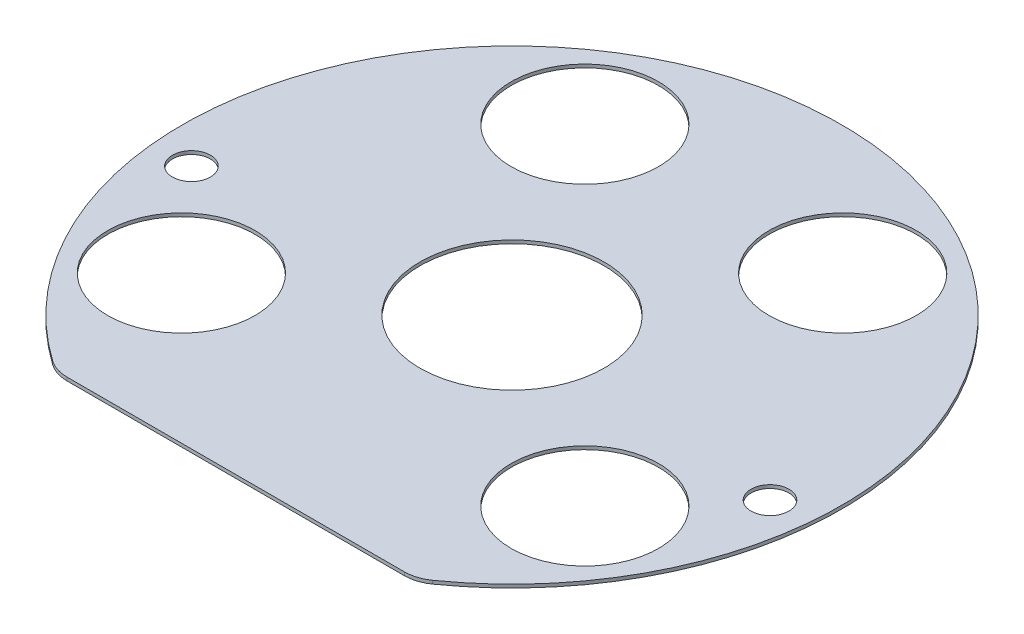
ISO-10303-21;
HEADER;
FILE_DESCRIPTION(('STEP AP214'),'2;1');
FILE_NAME('part.step','',(''),(''),'','','');
FILE_SCHEMA(('AUTOMOTIVE_DESIGN { 1 0 10303 214 1 1 1 1 }'));
ENDSEC;
DATA;
#1=APPLICATION_CONTEXT('core data for automotive mechanical design processes');
#2=APPLICATION_PROTOCOL_DEFINITION('international standard','automotive_design',2000,#1);
#3=PRODUCT_CONTEXT('',#1,'mechanical');
#4=PRODUCT('Part','Part','',(#3));
#5=PRODUCT_RELATED_PRODUCT_CATEGORY('part','',(#4));
#6=PRODUCT_DEFINITION_FORMATION('','',#4);
#7=PRODUCT_DEFINITION_CONTEXT('part definition',#1,'design');
#8=PRODUCT_DEFINITION('design','',#6,#7);
#9=PRODUCT_DEFINITION_SHAPE('','',#8);
#10=(LENGTH_UNIT() NAMED_UNIT(*) SI_UNIT(.MILLI.,.METRE.));
#11=(NAMED_UNIT(*) PLANE_ANGLE_UNIT() SI_UNIT($,.RADIAN.));
#12=(NAMED_UNIT(*) SI_UNIT($,.STERADIAN.) SOLID_ANGLE_UNIT());
#13=UNCERTAINTY_MEASURE_WITH_UNIT(LENGTH_MEASURE(1.E-05),#10,'distance_accuracy_value','');
#14=(GEOMETRIC_REPRESENTATION_CONTEXT(3) GLOBAL_UNCERTAINTY_ASSIGNED_CONTEXT((#13)) GLOBAL_UNIT_ASSIGNED_CONTEXT((#10,
#11,#12)) REPRESENTATION_CONTEXT('',''));
#15=CARTESIAN_POINT('',(0.,0.,0.));
#16=DIRECTION('',(0.,0.,1.));
#17=DIRECTION('',(1.,0.,0.));
#18=AXIS2_PLACEMENT_3D('',#15,#16,#17);
#19=CARTESIAN_POINT('',(0.,-0.91,0.));
#20=DIRECTION('',(0.,1.,0.));
#21=DIRECTION('',(0.,0.,1.));
#22=AXIS2_PLACEMENT_3D('',#19,#20,#21);
#23=CYLINDRICAL_SURFACE('',#22,89.5);
#24=CARTESIAN_POINT('',(0.,0.,0.));
#25=DIRECTION('',(0.,1.,0.));
#26=DIRECTION('',(0.,0.,1.));
#27=AXIS2_PLACEMENT_3D('',#24,#25,#26);
#28=CIRCLE('',#27,89.5);
#29=CARTESIAN_POINT('',(51.5316242393406,0.,73.1761006289308));
#30=VERTEX_POINT('',#29);
#31=CARTESIAN_POINT('',(-51.5316242393406,0.,73.1761006289308));
#32=VERTEX_POINT('',#31);
#33=EDGE_CURVE('E81',#30,#32,#28,.T.);
#34=ORIENTED_EDGE('',*,*,#33,.F.);
#35=DIRECTION('',(0.,1.,0.));
#36=VECTOR('',#35,1.);
#37=CARTESIAN_POINT('',(51.5316242393405,-0.91,73.1761006289308));
#38=LINE('',#37,#36);
#39=CARTESIAN_POINT('',(51.5316242393406,-0.91,73.1761006289308));
#40=VERTEX_POINT('',#39);
#41=EDGE_CURVE('E57',#30,#40,#38,.F.);
#42=ORIENTED_EDGE('',*,*,#41,.T.);
#43=CARTESIAN_POINT('',(0.,-0.91,0.));
#44=DIRECTION('',(0.,1.,0.));
#45=DIRECTION('',(0.,0.,1.));
#46=AXIS2_PLACEMENT_3D('',#43,#44,#45);
#47=CIRCLE('',#46,89.5);
#48=CARTESIAN_POINT('',(-51.5316242393406,-0.91,73.1761006289308));
#49=VERTEX_POINT('',#48);
#50=EDGE_CURVE('E95',#40,#49,#47,.T.);
#51=ORIENTED_EDGE('',*,*,#50,.T.);
#52=DIRECTION('',(0.,1.,0.));
#53=VECTOR('',#52,1.);
#54=CARTESIAN_POINT('',(-51.5316242393405,-0.91,73.1761006289308));
#55=LINE('',#54,#53);
#56=EDGE_CURVE('E104',#49,#32,#55,.T.);
#57=ORIENTED_EDGE('',*,*,#56,.T.);
#58=EDGE_LOOP('',(#34,#42,#51,#57));
#59=FACE_BOUND('',#58,.T.);
#60=ADVANCED_FACE('F36',(#59),#23,.T.);
#61=CARTESIAN_POINT('',(-48.8390212842149,-0.91,75.));
#62=DIRECTION('',(0.,0.,1.));
#63=DIRECTION('',(1.,0.,0.));
#64=AXIS2_PLACEMENT_3D('',#61,#62,#63);
#65=PLANE('',#64);
#66=DIRECTION('',(1.,0.,0.));
#67=VECTOR('',#66,1.);
#68=CARTESIAN_POINT('',(-48.8390212842149,-0.91,75.));
#69=LINE('',#68,#67);
#70=CARTESIAN_POINT('',(-45.7739008606433,-0.91,75.));
#71=VERTEX_POINT('',#70);
#72=CARTESIAN_POINT('',(45.7739008606433,-0.91,75.));
#73=VERTEX_POINT('',#72);
#74=EDGE_CURVE('E97',#71,#73,#69,.T.);
#75=ORIENTED_EDGE('',*,*,#74,.T.);
#76=DIRECTION('',(0.,1.,0.));
#77=VECTOR('',#76,1.);
#78=CARTESIAN_POINT('',(45.7739008606433,-0.91,75.));
#79=LINE('',#78,#77);
#80=CARTESIAN_POINT('',(45.7739008606433,0.,75.));
#81=VERTEX_POINT('',#80);
#82=EDGE_CURVE('E87',#73,#81,#79,.T.);
#83=ORIENTED_EDGE('',*,*,#82,.T.);
#84=DIRECTION('',(1.,0.,0.));
#85=VECTOR('',#84,1.);
#86=CARTESIAN_POINT('',(-48.8390212842149,0.,75.));
#87=LINE('',#86,#85);
#88=CARTESIAN_POINT('',(-45.7739008606433,0.,75.));
#89=VERTEX_POINT('',#88);
#90=EDGE_CURVE('E80',#89,#81,#87,.T.);
#91=ORIENTED_EDGE('',*,*,#90,.F.);
#92=DIRECTION('',(0.,1.,0.));
#93=VECTOR('',#92,1.);
#94=CARTESIAN_POINT('',(-45.7739008606433,-0.91,75.));
#95=LINE('',#94,#93);
#96=EDGE_CURVE('E93',#89,#71,#95,.F.);
#97=ORIENTED_EDGE('',*,*,#96,.T.);
#98=EDGE_LOOP('',(#75,#83,#91,#97));
#99=FACE_BOUND('',#98,.T.);
#100=ADVANCED_FACE('F92',(#99),#65,.T.);
#101=CARTESIAN_POINT('',(0.,-0.91,0.));
#102=DIRECTION('',(0.,1.,0.));
#103=DIRECTION('',(0.,0.,1.));
#104=AXIS2_PLACEMENT_3D('',#101,#102,#103);
#105=PLANE('',#104);
#106=CARTESIAN_POINT('',(-35.,-0.910000000000006,-54.7722557505166));
#107=DIRECTION('',(0.,1.,0.));
#108=DIRECTION('',(0.,0.,1.));
#109=AXIS2_PLACEMENT_3D('',#106,#107,#108);
#110=CIRCLE('',#109,20.);
#111=CARTESIAN_POINT('',(-35.,-0.910000000000006,-34.7722557505166));
#112=VERTEX_POINT('',#111);
#113=EDGE_CURVE('E139',#112,#112,#110,.T.);
#114=ORIENTED_EDGE('',*,*,#113,.T.);
#115=EDGE_LOOP('',(#114));
#116=FACE_BOUND('',#115,.T.);
#117=CARTESIAN_POINT('',(35.,-0.910000000000006,-54.7722557505166));
#118=DIRECTION('',(0.,1.,0.));
#119=DIRECTION('',(0.,0.,1.));
#120=AXIS2_PLACEMENT_3D('',#117,#118,#119);
#121=CIRCLE('',#120,20.);
#122=CARTESIAN_POINT('',(35.,-0.910000000000006,-34.7722557505166));
#123=VERTEX_POINT('',#122);
#124=EDGE_CURVE('E145',#123,#123,#121,.T.);
#125=ORIENTED_EDGE('',*,*,#124,.T.);
#126=EDGE_LOOP('',(#125));
#127=FACE_BOUND('',#126,.T.);
#128=CARTESIAN_POINT('',(-54.7722557505166,-0.910000000000006,35.));
#129=DIRECTION('',(0.,1.,0.));
#130=DIRECTION('',(0.,0.,1.));
#131=AXIS2_PLACEMENT_3D('',#128,#129,#130);
#132=CIRCLE('',#131,20.);
#133=CARTESIAN_POINT('',(-54.7722557505166,-0.910000000000006,55.));
#134=VERTEX_POINT('',#133);
#135=EDGE_CURVE('E151',#134,#134,#132,.T.);
#136=ORIENTED_EDGE('',*,*,#135,.T.);
#137=EDGE_LOOP('',(#136));
#138=FACE_BOUND('',#137,.T.);
#139=CARTESIAN_POINT('',(54.7722557505166,-0.910000000000006,35.));
#140=DIRECTION('',(0.,1.,0.));
#141=DIRECTION('',(0.,0.,1.));
#142=AXIS2_PLACEMENT_3D('',#139,#140,#141);
#143=CIRCLE('',#142,20.);
#144=CARTESIAN_POINT('',(54.7722557505166,-0.910000000000006,55.));
#145=VERTEX_POINT('',#144);
#146=EDGE_CURVE('E134',#145,#145,#143,.T.);
#147=ORIENTED_EDGE('',*,*,#146,.T.);
#148=EDGE_LOOP('',(#147));
#149=FACE_BOUND('',#148,.T.);
#150=CARTESIAN_POINT('',(0.,-0.910000000000006,0.));
#151=DIRECTION('',(0.,1.,0.));
#152=DIRECTION('',(0.,0.,1.));
#153=AXIS2_PLACEMENT_3D('',#150,#151,#152);
#154=CIRCLE('',#153,25.);
#155=CARTESIAN_POINT('',(0.,-0.910000000000006,25.));
#156=VERTEX_POINT('',#155);
#157=EDGE_CURVE('E127',#156,#156,#154,.T.);
#158=ORIENTED_EDGE('',*,*,#157,.T.);
#159=EDGE_LOOP('',(#158));
#160=FACE_BOUND('',#159,.T.);
#161=CARTESIAN_POINT('',(-78.5412092321762,-0.910000000000006,8.50167350275914));
#162=DIRECTION('',(0.,1.,0.));
#163=DIRECTION('',(0.,0.,1.));
#164=AXIS2_PLACEMENT_3D('',#161,#162,#163);
#165=CIRCLE('',#164,5.15);
#166=CARTESIAN_POINT('',(-78.5412092321762,-0.910000000000006,13.6516735027591));
#167=VERTEX_POINT('',#166);
#168=EDGE_CURVE('E111',#167,#167,#165,.T.);
#169=ORIENTED_EDGE('',*,*,#168,.T.);
#170=EDGE_LOOP('',(#169));
#171=FACE_BOUND('',#170,.T.);
#172=CARTESIAN_POINT('',(78.5412092321762,-0.910000000000006,8.50167350275912));
#173=DIRECTION('',(0.,1.,0.));
#174=DIRECTION('',(0.,0.,1.));
#175=AXIS2_PLACEMENT_3D('',#172,#173,#174);
#176=CIRCLE('',#175,5.15);
#177=CARTESIAN_POINT('',(78.5412092321762,-0.910000000000006,13.6516735027591));
#178=VERTEX_POINT('',#177);
#179=EDGE_CURVE('E109',#178,#178,#176,.T.);
#180=ORIENTED_EDGE('',*,*,#179,.T.);
#181=EDGE_LOOP('',(#180));
#182=FACE_BOUND('',#181,.T.);
#183=ORIENTED_EDGE('',*,*,#50,.F.);
#184=CARTESIAN_POINT('',(45.7739008606433,-0.91,65.));
#185=DIRECTION('',(0.,1.,0.));
#186=DIRECTION('',(0.,0.,1.));
#187=AXIS2_PLACEMENT_3D('',#184,#185,#186);
#188=CIRCLE('',#187,10.);
#189=EDGE_CURVE('E11',#40,#73,#188,.F.);
#190=ORIENTED_EDGE('',*,*,#189,.T.);
#191=ORIENTED_EDGE('',*,*,#74,.F.);
#192=CARTESIAN_POINT('',(-45.7739008606433,-0.91,65.));
#193=DIRECTION('',(0.,1.,0.));
#194=DIRECTION('',(0.,0.,1.));
#195=AXIS2_PLACEMENT_3D('',#192,#193,#194);
#196=CIRCLE('',#195,10.);
#197=EDGE_CURVE('E44',#71,#49,#196,.F.);
#198=ORIENTED_EDGE('',*,*,#197,.T.);
#199=EDGE_LOOP('',(#183,#190,#191,#198));
#200=FACE_BOUND('',#199,.T.);
#201=ADVANCED_FACE('F160',(#116,#127,#138,#149,#160,#171,#182,#200),#105,.F.);
#202=CARTESIAN_POINT('',(0.,0.,0.));
#203=DIRECTION('',(0.,1.,0.));
#204=DIRECTION('',(0.,0.,1.));
#205=AXIS2_PLACEMENT_3D('',#202,#203,#204);
#206=PLANE('',#205);
#207=CARTESIAN_POINT('',(-35.,0.,-54.7722557505166));
#208=DIRECTION('',(0.,1.,0.));
#209=DIRECTION('',(0.,0.,1.));
#210=AXIS2_PLACEMENT_3D('',#207,#208,#209);
#211=CIRCLE('',#210,20.);
#212=CARTESIAN_POINT('',(-35.,0.,-34.7722557505166));
#213=VERTEX_POINT('',#212);
#214=EDGE_CURVE('E136',#213,#213,#211,.T.);
#215=ORIENTED_EDGE('',*,*,#214,.F.);
#216=EDGE_LOOP('',(#215));
#217=FACE_BOUND('',#216,.T.);
#218=CARTESIAN_POINT('',(35.,0.,-54.7722557505166));
#219=DIRECTION('',(0.,1.,0.));
#220=DIRECTION('',(0.,0.,1.));
#221=AXIS2_PLACEMENT_3D('',#218,#219,#220);
#222=CIRCLE('',#221,20.);
#223=CARTESIAN_POINT('',(35.,0.,-34.7722557505166));
#224=VERTEX_POINT('',#223);
#225=EDGE_CURVE('E142',#224,#224,#222,.T.);
#226=ORIENTED_EDGE('',*,*,#225,.F.);
#227=EDGE_LOOP('',(#226));
#228=FACE_BOUND('',#227,.T.);
#229=CARTESIAN_POINT('',(-54.7722557505166,0.,35.));
#230=DIRECTION('',(0.,1.,0.));
#231=DIRECTION('',(0.,0.,1.));
#232=AXIS2_PLACEMENT_3D('',#229,#230,#231);
#233=CIRCLE('',#232,20.);
#234=CARTESIAN_POINT('',(-54.7722557505166,0.,55.));
#235=VERTEX_POINT('',#234);
#236=EDGE_CURVE('E148',#235,#235,#233,.T.);
#237=ORIENTED_EDGE('',*,*,#236,.F.);
#238=EDGE_LOOP('',(#237));
#239=FACE_BOUND('',#238,.T.);
#240=CARTESIAN_POINT('',(54.7722557505166,0.,35.));
#241=DIRECTION('',(0.,1.,0.));
#242=DIRECTION('',(0.,0.,1.));
#243=AXIS2_PLACEMENT_3D('',#240,#241,#242);
#244=CIRCLE('',#243,20.);
#245=CARTESIAN_POINT('',(54.7722557505166,0.,55.));
#246=VERTEX_POINT('',#245);
#247=EDGE_CURVE('E154',#246,#246,#244,.T.);
#248=ORIENTED_EDGE('',*,*,#247,.F.);
#249=EDGE_LOOP('',(#248));
#250=FACE_BOUND('',#249,.T.);
#251=CARTESIAN_POINT('',(0.,0.,0.));
#252=DIRECTION('',(0.,1.,0.));
#253=DIRECTION('',(0.,0.,1.));
#254=AXIS2_PLACEMENT_3D('',#251,#252,#253);
#255=CIRCLE('',#254,25.);
#256=CARTESIAN_POINT('',(0.,0.,25.));
#257=VERTEX_POINT('',#256);
#258=EDGE_CURVE('E121',#257,#257,#255,.T.);
#259=ORIENTED_EDGE('',*,*,#258,.F.);
#260=EDGE_LOOP('',(#259));
#261=FACE_BOUND('',#260,.T.);
#262=CARTESIAN_POINT('',(-78.5412092321762,0.,8.50167350275914));
#263=DIRECTION('',(0.,1.,0.));
#264=DIRECTION('',(0.,0.,1.));
#265=AXIS2_PLACEMENT_3D('',#262,#263,#264);
#266=CIRCLE('',#265,5.15);
#267=CARTESIAN_POINT('',(-78.5412092321762,0.,13.6516735027591));
#268=VERTEX_POINT('',#267);
#269=EDGE_CURVE('E113',#268,#268,#266,.T.);
#270=ORIENTED_EDGE('',*,*,#269,.F.);
#271=EDGE_LOOP('',(#270));
#272=FACE_BOUND('',#271,.T.);
#273=CARTESIAN_POINT('',(78.5412092321762,0.,8.50167350275912));
#274=DIRECTION('',(0.,1.,0.));
#275=DIRECTION('',(0.,0.,1.));
#276=AXIS2_PLACEMENT_3D('',#273,#274,#275);
#277=CIRCLE('',#276,5.15);
#278=CARTESIAN_POINT('',(78.5412092321762,0.,13.6516735027591));
#279=VERTEX_POINT('',#278);
#280=EDGE_CURVE('E118',#279,#279,#277,.T.);
#281=ORIENTED_EDGE('',*,*,#280,.F.);
#282=EDGE_LOOP('',(#281));
#283=FACE_BOUND('',#282,.T.);
#284=ORIENTED_EDGE('',*,*,#90,.T.);
#285=CARTESIAN_POINT('',(45.7739008606433,0.,65.));
#286=DIRECTION('',(0.,1.,0.));
#287=DIRECTION('',(0.,0.,1.));
#288=AXIS2_PLACEMENT_3D('',#285,#286,#287);
#289=CIRCLE('',#288,10.);
#290=EDGE_CURVE('E86',#81,#30,#289,.T.);
#291=ORIENTED_EDGE('',*,*,#290,.T.);
#292=ORIENTED_EDGE('',*,*,#33,.T.);
#293=CARTESIAN_POINT('',(-45.7739008606433,0.,65.));
#294=DIRECTION('',(0.,1.,0.));
#295=DIRECTION('',(0.,0.,1.));
#296=AXIS2_PLACEMENT_3D('',#293,#294,#295);
#297=CIRCLE('',#296,10.);
#298=EDGE_CURVE('E77',#32,#89,#297,.T.);
#299=ORIENTED_EDGE('',*,*,#298,.T.);
#300=EDGE_LOOP('',(#284,#291,#292,#299));
#301=FACE_BOUND('',#300,.T.);
#302=ADVANCED_FACE('F79',(#217,#228,#239,#250,#261,#272,#283,#301),#206,.T.);
#303=CARTESIAN_POINT('',(78.5412092321762,-0.910000000000006,8.50167350275912));
#304=DIRECTION('',(0.,1.,0.));
#305=DIRECTION('',(0.,0.,1.));
#306=AXIS2_PLACEMENT_3D('',#303,#304,#305);
#307=CYLINDRICAL_SURFACE('',#306,5.15);
#308=ORIENTED_EDGE('',*,*,#179,.F.);
#309=EDGE_LOOP('',(#308));
#310=FACE_BOUND('',#309,.T.);
#311=ORIENTED_EDGE('',*,*,#280,.T.);
#312=EDGE_LOOP('',(#311));
#313=FACE_BOUND('',#312,.T.);
#314=ADVANCED_FACE('F172',(#310,#313),#307,.F.);
#315=CARTESIAN_POINT('',(-78.5412092321762,-0.910000000000006,8.50167350275914));
#316=DIRECTION('',(0.,1.,0.));
#317=DIRECTION('',(0.,0.,1.));
#318=AXIS2_PLACEMENT_3D('',#315,#316,#317);
#319=CYLINDRICAL_SURFACE('',#318,5.15);
#320=ORIENTED_EDGE('',*,*,#168,.F.);
#321=EDGE_LOOP('',(#320));
#322=FACE_BOUND('',#321,.T.);
#323=ORIENTED_EDGE('',*,*,#269,.T.);
#324=EDGE_LOOP('',(#323));
#325=FACE_BOUND('',#324,.T.);
#326=ADVANCED_FACE('F180',(#322,#325),#319,.F.);
#327=CARTESIAN_POINT('',(0.,-0.910000000000006,0.));
#328=DIRECTION('',(0.,1.,0.));
#329=DIRECTION('',(0.,0.,1.));
#330=AXIS2_PLACEMENT_3D('',#327,#328,#329);
#331=CYLINDRICAL_SURFACE('',#330,25.);
#332=ORIENTED_EDGE('',*,*,#157,.F.);
#333=EDGE_LOOP('',(#332));
#334=FACE_BOUND('',#333,.T.);
#335=ORIENTED_EDGE('',*,*,#258,.T.);
#336=EDGE_LOOP('',(#335));
#337=FACE_BOUND('',#336,.T.);
#338=ADVANCED_FACE('F166',(#334,#337),#331,.F.);
#339=CARTESIAN_POINT('',(54.7722557505166,-0.910000000000006,35.));
#340=DIRECTION('',(0.,1.,0.));
#341=DIRECTION('',(0.,0.,1.));
#342=AXIS2_PLACEMENT_3D('',#339,#340,#341);
#343=CYLINDRICAL_SURFACE('',#342,20.);
#344=ORIENTED_EDGE('',*,*,#146,.F.);
#345=EDGE_LOOP('',(#344));
#346=FACE_BOUND('',#345,.T.);
#347=ORIENTED_EDGE('',*,*,#247,.T.);
#348=EDGE_LOOP('',(#347));
#349=FACE_BOUND('',#348,.T.);
#350=ADVANCED_FACE('F162',(#346,#349),#343,.F.);
#351=CARTESIAN_POINT('',(-54.7722557505166,-0.910000000000006,35.));
#352=DIRECTION('',(0.,1.,0.));
#353=DIRECTION('',(0.,0.,1.));
#354=AXIS2_PLACEMENT_3D('',#351,#352,#353);
#355=CYLINDRICAL_SURFACE('',#354,20.);
#356=ORIENTED_EDGE('',*,*,#135,.F.);
#357=EDGE_LOOP('',(#356));
#358=FACE_BOUND('',#357,.T.);
#359=ORIENTED_EDGE('',*,*,#236,.T.);
#360=EDGE_LOOP('',(#359));
#361=FACE_BOUND('',#360,.T.);
#362=ADVANCED_FACE('F165',(#358,#361),#355,.F.);
#363=CARTESIAN_POINT('',(35.,-0.910000000000006,-54.7722557505166));
#364=DIRECTION('',(0.,1.,0.));
#365=DIRECTION('',(0.,0.,1.));
#366=AXIS2_PLACEMENT_3D('',#363,#364,#365);
#367=CYLINDRICAL_SURFACE('',#366,20.);
#368=ORIENTED_EDGE('',*,*,#124,.F.);
#369=EDGE_LOOP('',(#368));
#370=FACE_BOUND('',#369,.T.);
#371=ORIENTED_EDGE('',*,*,#225,.T.);
#372=EDGE_LOOP('',(#371));
#373=FACE_BOUND('',#372,.T.);
#374=ADVANCED_FACE('F206',(#370,#373),#367,.F.);
#375=CARTESIAN_POINT('',(-35.,-0.910000000000006,-54.7722557505166));
#376=DIRECTION('',(0.,1.,0.));
#377=DIRECTION('',(0.,0.,1.));
#378=AXIS2_PLACEMENT_3D('',#375,#376,#377);
#379=CYLINDRICAL_SURFACE('',#378,20.);
#380=ORIENTED_EDGE('',*,*,#113,.F.);
#381=EDGE_LOOP('',(#380));
#382=FACE_BOUND('',#381,.T.);
#383=ORIENTED_EDGE('',*,*,#214,.T.);
#384=EDGE_LOOP('',(#383));
#385=FACE_BOUND('',#384,.T.);
#386=ADVANCED_FACE('F200',(#382,#385),#379,.F.);
#387=CARTESIAN_POINT('',(45.7739008606433,-0.91,65.));
#388=DIRECTION('',(0.,1.,0.));
#389=DIRECTION('',(0.,0.,1.));
#390=AXIS2_PLACEMENT_3D('',#387,#388,#389);
#391=CYLINDRICAL_SURFACE('',#390,10.);
#392=ORIENTED_EDGE('',*,*,#189,.F.);
#393=ORIENTED_EDGE('',*,*,#41,.F.);
#394=ORIENTED_EDGE('',*,*,#290,.F.);
#395=ORIENTED_EDGE('',*,*,#82,.F.);
#396=EDGE_LOOP('',(#392,#393,#394,#395));
#397=FACE_BOUND('',#396,.T.);
#398=ADVANCED_FACE('F198',(#397),#391,.T.);
#399=CARTESIAN_POINT('',(-45.7739008606433,-0.91,65.));
#400=DIRECTION('',(0.,1.,0.));
#401=DIRECTION('',(0.,0.,1.));
#402=AXIS2_PLACEMENT_3D('',#399,#400,#401);
#403=CYLINDRICAL_SURFACE('',#402,10.);
#404=ORIENTED_EDGE('',*,*,#197,.F.);
#405=ORIENTED_EDGE('',*,*,#96,.F.);
#406=ORIENTED_EDGE('',*,*,#298,.F.);
#407=ORIENTED_EDGE('',*,*,#56,.F.);
#408=EDGE_LOOP('',(#404,#405,#406,#407));
#409=FACE_BOUND('',#408,.T.);
#410=ADVANCED_FACE('F38',(#409),#403,.T.);
#411=CLOSED_SHELL('',(#60,#100,#201,#302,#314,#326,#338,#350,#362,#374,#386,#398,#410));
#412=MANIFOLD_SOLID_BREP('B2',#411);
#413=ADVANCED_BREP_SHAPE_REPRESENTATION('',(#18,#412),#14);
#414=SHAPE_DEFINITION_REPRESENTATION(#9,#413);
ENDSEC;
END-ISO-10303-21;
